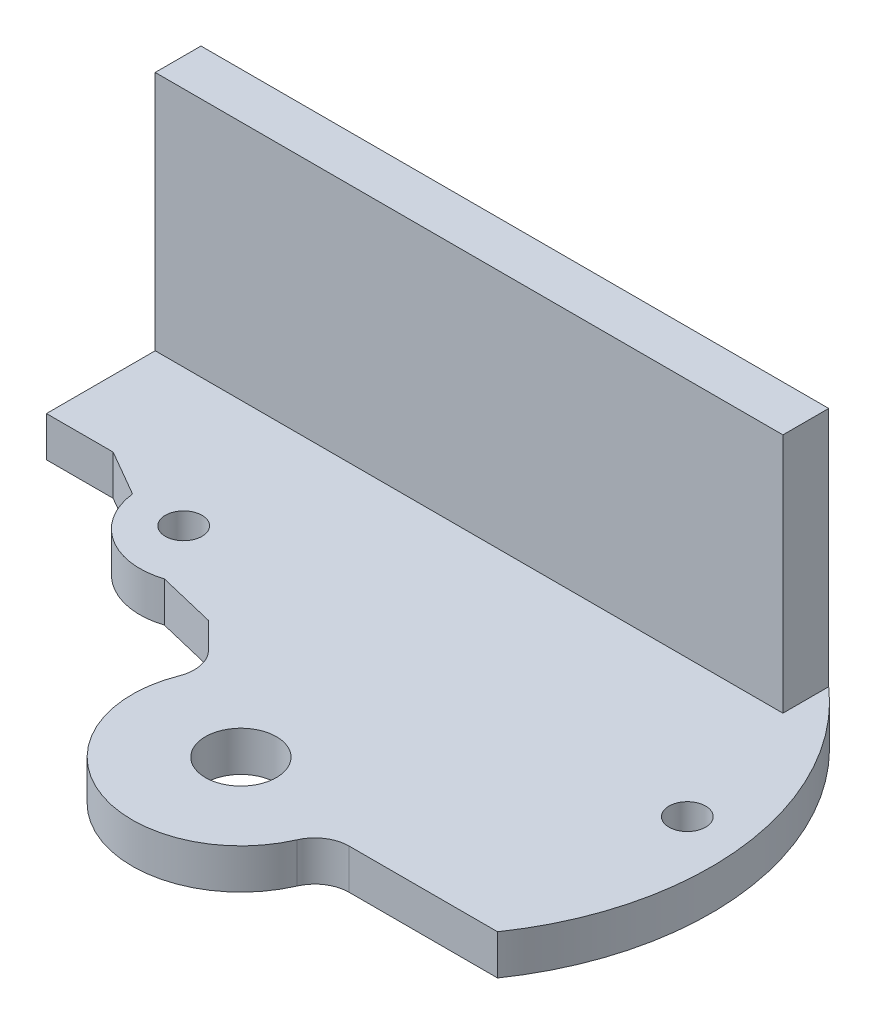
ISO-10303-21;
HEADER;
FILE_DESCRIPTION(('STEP AP214'),'2;1');
FILE_NAME('part.step','',(''),(''),'','','');
FILE_SCHEMA(('AUTOMOTIVE_DESIGN { 1 0 10303 214 1 1 1 1 }'));
ENDSEC;
DATA;
#1=APPLICATION_CONTEXT('core data for automotive mechanical design processes');
#2=APPLICATION_PROTOCOL_DEFINITION('international standard','automotive_design',2000,#1);
#3=PRODUCT_CONTEXT('',#1,'mechanical');
#4=PRODUCT('Part','Part','',(#3));
#5=PRODUCT_RELATED_PRODUCT_CATEGORY('part','',(#4));
#6=PRODUCT_DEFINITION_FORMATION('','',#4);
#7=PRODUCT_DEFINITION_CONTEXT('part definition',#1,'design');
#8=PRODUCT_DEFINITION('design','',#6,#7);
#9=PRODUCT_DEFINITION_SHAPE('','',#8);
#10=(LENGTH_UNIT() NAMED_UNIT(*) SI_UNIT(.MILLI.,.METRE.));
#11=(NAMED_UNIT(*) PLANE_ANGLE_UNIT() SI_UNIT($,.RADIAN.));
#12=(NAMED_UNIT(*) SI_UNIT($,.STERADIAN.) SOLID_ANGLE_UNIT());
#13=UNCERTAINTY_MEASURE_WITH_UNIT(LENGTH_MEASURE(1.E-05),#10,'distance_accuracy_value','');
#14=(GEOMETRIC_REPRESENTATION_CONTEXT(3) GLOBAL_UNCERTAINTY_ASSIGNED_CONTEXT((#13)) GLOBAL_UNIT_ASSIGNED_CONTEXT((#10,
#11,#12)) REPRESENTATION_CONTEXT('',''));
#15=CARTESIAN_POINT('',(0.,0.,0.));
#16=DIRECTION('',(0.,0.,1.));
#17=DIRECTION('',(1.,0.,0.));
#18=AXIS2_PLACEMENT_3D('',#15,#16,#17);
#19=CARTESIAN_POINT('',(20.3496,17.,-13.5));
#20=DIRECTION('',(0.,0.,1.));
#21=DIRECTION('',(1.,0.,0.));
#22=AXIS2_PLACEMENT_3D('',#19,#20,#21);
#23=PLANE('',#22);
#24=DIRECTION('',(-1.,0.,0.));
#25=VECTOR('',#24,1.);
#26=CARTESIAN_POINT('',(20.3496,13.5,-13.5));
#27=LINE('',#26,#25);
#28=CARTESIAN_POINT('',(20.3496,13.5,-13.5));
#29=VERTEX_POINT('',#28);
#30=CARTESIAN_POINT('',(-34.4868,13.5,-13.5));
#31=VERTEX_POINT('',#30);
#32=EDGE_CURVE('E170',#29,#31,#27,.T.);
#33=ORIENTED_EDGE('',*,*,#32,.T.);
#34=DIRECTION('',(0.,-1.,0.));
#35=VECTOR('',#34,1.);
#36=CARTESIAN_POINT('',(-34.4868,17.,-13.5));
#37=LINE('',#36,#35);
#38=CARTESIAN_POINT('',(-34.4868,38.0559630595284,-13.5));
#39=VERTEX_POINT('',#38);
#40=EDGE_CURVE('E12',#39,#31,#37,.T.);
#41=ORIENTED_EDGE('',*,*,#40,.F.);
#42=DIRECTION('',(1.,0.,0.));
#43=VECTOR('',#42,1.);
#44=CARTESIAN_POINT('',(-34.4868,38.0559630595284,-13.5));
#45=LINE('',#44,#43);
#46=CARTESIAN_POINT('',(20.3496,38.0559630595284,-13.5));
#47=VERTEX_POINT('',#46);
#48=EDGE_CURVE('E299',#39,#47,#45,.T.);
#49=ORIENTED_EDGE('',*,*,#48,.T.);
#50=DIRECTION('',(0.,-1.,0.));
#51=VECTOR('',#50,1.);
#52=CARTESIAN_POINT('',(20.3496,38.0559630595284,-13.5));
#53=LINE('',#52,#51);
#54=CARTESIAN_POINT('',(20.3496,17.,-13.5));
#55=VERTEX_POINT('',#54);
#56=EDGE_CURVE('E288',#47,#55,#53,.T.);
#57=ORIENTED_EDGE('',*,*,#56,.T.);
#58=DIRECTION('',(0.,-1.,0.));
#59=VECTOR('',#58,1.);
#60=CARTESIAN_POINT('',(20.3496,17.,-13.5));
#61=LINE('',#60,#59);
#62=EDGE_CURVE('E169',#55,#29,#61,.T.);
#63=ORIENTED_EDGE('',*,*,#62,.T.);
#64=EDGE_LOOP('',(#33,#41,#49,#57,#63));
#65=FACE_BOUND('',#64,.T.);
#66=ADVANCED_FACE('F36',(#65),#23,.F.);
#67=CARTESIAN_POINT('',(-34.4868,17.,-13.5));
#68=DIRECTION('',(1.,0.,0.));
#69=DIRECTION('',(0.,0.,-1.));
#70=AXIS2_PLACEMENT_3D('',#67,#68,#69);
#71=PLANE('',#70);
#72=DIRECTION('',(0.,0.,1.));
#73=VECTOR('',#72,1.);
#74=CARTESIAN_POINT('',(-34.4868,13.5,-13.5));
#75=LINE('',#74,#73);
#76=CARTESIAN_POINT('',(-34.4868,13.5,0.));
#77=VERTEX_POINT('',#76);
#78=EDGE_CURVE('E173',#31,#77,#75,.T.);
#79=ORIENTED_EDGE('',*,*,#78,.T.);
#80=DIRECTION('',(0.,-1.,0.));
#81=VECTOR('',#80,1.);
#82=CARTESIAN_POINT('',(-34.4868,17.,0.));
#83=LINE('',#82,#81);
#84=CARTESIAN_POINT('',(-34.4868,17.,0.));
#85=VERTEX_POINT('',#84);
#86=EDGE_CURVE('E44',#85,#77,#83,.T.);
#87=ORIENTED_EDGE('',*,*,#86,.F.);
#88=DIRECTION('',(0.,0.,1.));
#89=VECTOR('',#88,1.);
#90=CARTESIAN_POINT('',(-34.4868,17.,-13.5));
#91=LINE('',#90,#89);
#92=CARTESIAN_POINT('',(-34.4868,17.,-9.49999999999999));
#93=VERTEX_POINT('',#92);
#94=EDGE_CURVE('E114',#93,#85,#91,.T.);
#95=ORIENTED_EDGE('',*,*,#94,.F.);
#96=DIRECTION('',(0.,1.,0.));
#97=VECTOR('',#96,1.);
#98=CARTESIAN_POINT('',(-34.4868,17.,-9.49999999999999));
#99=LINE('',#98,#97);
#100=CARTESIAN_POINT('',(-34.4868,38.0559630595284,-9.49999999999999));
#101=VERTEX_POINT('',#100);
#102=EDGE_CURVE('E52',#93,#101,#99,.T.);
#103=ORIENTED_EDGE('',*,*,#102,.T.);
#104=DIRECTION('',(0.,0.,-1.));
#105=VECTOR('',#104,1.);
#106=CARTESIAN_POINT('',(-34.4868,38.0559630595284,-9.49999999999999));
#107=LINE('',#106,#105);
#108=EDGE_CURVE('E289',#101,#39,#107,.T.);
#109=ORIENTED_EDGE('',*,*,#108,.T.);
#110=ORIENTED_EDGE('',*,*,#40,.T.);
#111=EDGE_LOOP('',(#79,#87,#95,#103,#109,#110));
#112=FACE_BOUND('',#111,.T.);
#113=ADVANCED_FACE('F330',(#112),#71,.F.);
#114=CARTESIAN_POINT('',(-34.4868,17.,0.));
#115=DIRECTION('',(0.,0.,-1.));
#116=DIRECTION('',(-1.,0.,0.));
#117=AXIS2_PLACEMENT_3D('',#114,#115,#116);
#118=PLANE('',#117);
#119=DIRECTION('',(1.,0.,0.));
#120=VECTOR('',#119,1.);
#121=CARTESIAN_POINT('',(-34.4868,13.5,0.));
#122=LINE('',#121,#120);
#123=CARTESIAN_POINT('',(-28.6613749786786,13.5,0.));
#124=VERTEX_POINT('',#123);
#125=EDGE_CURVE('E176',#77,#124,#122,.T.);
#126=ORIENTED_EDGE('',*,*,#125,.T.);
#127=DIRECTION('',(0.,-1.,0.));
#128=VECTOR('',#127,1.);
#129=CARTESIAN_POINT('',(-28.6613749786786,17.,0.));
#130=LINE('',#129,#128);
#131=CARTESIAN_POINT('',(-28.6613749786786,17.,0.));
#132=VERTEX_POINT('',#131);
#133=EDGE_CURVE('E211',#132,#124,#130,.T.);
#134=ORIENTED_EDGE('',*,*,#133,.F.);
#135=DIRECTION('',(1.,0.,0.));
#136=VECTOR('',#135,1.);
#137=CARTESIAN_POINT('',(-34.4868,17.,0.));
#138=LINE('',#137,#136);
#139=EDGE_CURVE('E229',#85,#132,#138,.T.);
#140=ORIENTED_EDGE('',*,*,#139,.F.);
#141=ORIENTED_EDGE('',*,*,#86,.T.);
#142=EDGE_LOOP('',(#126,#134,#140,#141));
#143=FACE_BOUND('',#142,.T.);
#144=ADVANCED_FACE('F335',(#143),#118,.F.);
#145=CARTESIAN_POINT('',(-28.6613749786786,17.,0.));
#146=DIRECTION('',(0.500442701800588,0.,-0.865769658866911));
#147=DIRECTION('',(-0.865769658866911,0.,-0.500442701800588));
#148=AXIS2_PLACEMENT_3D('',#145,#146,#147);
#149=PLANE('',#148);
#150=DIRECTION('',(0.865769658866911,0.,0.500442701800588));
#151=VECTOR('',#150,1.);
#152=CARTESIAN_POINT('',(-28.6613749786786,13.5,0.));
#153=LINE('',#152,#151);
#154=CARTESIAN_POINT('',(-24.6424002082218,13.5,2.32309664816397));
#155=VERTEX_POINT('',#154);
#156=EDGE_CURVE('E178',#124,#155,#153,.T.);
#157=ORIENTED_EDGE('',*,*,#156,.T.);
#158=DIRECTION('',(0.,-1.,0.));
#159=VECTOR('',#158,1.);
#160=CARTESIAN_POINT('',(-24.6424002082218,17.,2.32309664816397));
#161=LINE('',#160,#159);
#162=CARTESIAN_POINT('',(-24.6424002082218,17.,2.32309664816397));
#163=VERTEX_POINT('',#162);
#164=EDGE_CURVE('E208',#163,#155,#161,.T.);
#165=ORIENTED_EDGE('',*,*,#164,.F.);
#166=DIRECTION('',(0.865769658866911,0.,0.500442701800588));
#167=VECTOR('',#166,1.);
#168=CARTESIAN_POINT('',(-28.6613749786786,17.,0.));
#169=LINE('',#168,#167);
#170=EDGE_CURVE('E237',#132,#163,#169,.T.);
#171=ORIENTED_EDGE('',*,*,#170,.F.);
#172=ORIENTED_EDGE('',*,*,#133,.T.);
#173=EDGE_LOOP('',(#157,#165,#171,#172));
#174=FACE_BOUND('',#173,.T.);
#175=ADVANCED_FACE('F347',(#174),#149,.F.);
#176=CARTESIAN_POINT('',(-18.6805102122051,17.,1.64791691254111));
#177=DIRECTION('',(0.,-1.,0.));
#178=DIRECTION('',(0.,0.,-1.));
#179=AXIS2_PLACEMENT_3D('',#176,#177,#178);
#180=CYLINDRICAL_SURFACE('',#179,6.);
#181=CARTESIAN_POINT('',(-18.6805102122051,13.5,1.64791691254111));
#182=DIRECTION('',(0.,1.,0.));
#183=DIRECTION('',(0.,0.,1.));
#184=AXIS2_PLACEMENT_3D('',#181,#182,#183);
#185=CIRCLE('',#184,6.);
#186=CARTESIAN_POINT('',(-16.8299633080181,13.5,7.35540989592743));
#187=VERTEX_POINT('',#186);
#188=EDGE_CURVE('E180',#155,#187,#185,.T.);
#189=ORIENTED_EDGE('',*,*,#188,.T.);
#190=DIRECTION('',(0.,-1.,0.));
#191=VECTOR('',#190,1.);
#192=CARTESIAN_POINT('',(-16.8299633080181,17.,7.35540989592743));
#193=LINE('',#192,#191);
#194=CARTESIAN_POINT('',(-16.8299633080181,17.,7.35540989592743));
#195=VERTEX_POINT('',#194);
#196=EDGE_CURVE('E205',#195,#187,#193,.T.);
#197=ORIENTED_EDGE('',*,*,#196,.F.);
#198=CARTESIAN_POINT('',(-18.6805102122051,17.,1.64791691254111));
#199=DIRECTION('',(0.,1.,0.));
#200=DIRECTION('',(0.,0.,1.));
#201=AXIS2_PLACEMENT_3D('',#198,#199,#200);
#202=CIRCLE('',#201,6.);
#203=EDGE_CURVE('E239',#163,#195,#202,.T.);
#204=ORIENTED_EDGE('',*,*,#203,.F.);
#205=ORIENTED_EDGE('',*,*,#164,.T.);
#206=EDGE_LOOP('',(#189,#197,#204,#205));
#207=FACE_BOUND('',#206,.T.);
#208=ADVANCED_FACE('F350',(#207),#180,.T.);
#209=CARTESIAN_POINT('',(-16.8299633080181,17.,7.35540989592743));
#210=DIRECTION('',(0.233748216217537,0.,-0.972297162093524));
#211=DIRECTION('',(-0.972297162093524,0.,-0.233748216217537));
#212=AXIS2_PLACEMENT_3D('',#209,#210,#211);
#213=PLANE('',#212);
#214=DIRECTION('',(0.972297162093524,0.,0.233748216217537));
#215=VECTOR('',#214,1.);
#216=CARTESIAN_POINT('',(-16.8299633080181,13.5,7.35540989592743));
#217=LINE('',#216,#215);
#218=CARTESIAN_POINT('',(-11.7523069819295,13.5,8.57612014281668));
#219=VERTEX_POINT('',#218);
#220=EDGE_CURVE('E182',#187,#219,#217,.T.);
#221=ORIENTED_EDGE('',*,*,#220,.T.);
#222=DIRECTION('',(0.,-1.,0.));
#223=VECTOR('',#222,1.);
#224=CARTESIAN_POINT('',(-11.7523069819295,17.,8.57612014281668));
#225=LINE('',#224,#223);
#226=CARTESIAN_POINT('',(-11.7523069819295,17.,8.57612014281668));
#227=VERTEX_POINT('',#226);
#228=EDGE_CURVE('E202',#227,#219,#225,.T.);
#229=ORIENTED_EDGE('',*,*,#228,.F.);
#230=DIRECTION('',(0.972297162093524,0.,0.233748216217537));
#231=VECTOR('',#230,1.);
#232=CARTESIAN_POINT('',(-16.8299633080181,17.,7.35540989592743));
#233=LINE('',#232,#231);
#234=EDGE_CURVE('E241',#195,#227,#233,.T.);
#235=ORIENTED_EDGE('',*,*,#234,.F.);
#236=ORIENTED_EDGE('',*,*,#196,.T.);
#237=EDGE_LOOP('',(#221,#229,#235,#236));
#238=FACE_BOUND('',#237,.T.);
#239=ADVANCED_FACE('F353',(#238),#213,.F.);
#240=CARTESIAN_POINT('',(-11.7523069819295,17.,8.57612014281668));
#241=DIRECTION('',(0.707106781186547,0.,-0.707106781186548));
#242=DIRECTION('',(-0.707106781186548,0.,-0.707106781186547));
#243=AXIS2_PLACEMENT_3D('',#240,#241,#242);
#244=PLANE('',#243);
#245=DIRECTION('',(0.707106781186548,0.,0.707106781186547));
#246=VECTOR('',#245,1.);
#247=CARTESIAN_POINT('',(-11.7523069819295,13.5,8.57612014281668));
#248=LINE('',#247,#246);
#249=CARTESIAN_POINT('',(-9.51513943538292,13.5,10.8132876893633));
#250=VERTEX_POINT('',#249);
#251=EDGE_CURVE('E184',#219,#250,#248,.T.);
#252=ORIENTED_EDGE('',*,*,#251,.T.);
#253=DIRECTION('',(0.,-1.,0.));
#254=VECTOR('',#253,1.);
#255=CARTESIAN_POINT('',(-9.51513943538292,17.,10.8132876893633));
#256=LINE('',#255,#254);
#257=CARTESIAN_POINT('',(-9.51513943538292,17.,10.8132876893633));
#258=VERTEX_POINT('',#257);
#259=EDGE_CURVE('E199',#258,#250,#256,.T.);
#260=ORIENTED_EDGE('',*,*,#259,.F.);
#261=DIRECTION('',(0.707106781186548,0.,0.707106781186547));
#262=VECTOR('',#261,1.);
#263=CARTESIAN_POINT('',(-11.7523069819295,17.,8.57612014281668));
#264=LINE('',#263,#262);
#265=EDGE_CURVE('E243',#227,#258,#264,.T.);
#266=ORIENTED_EDGE('',*,*,#265,.F.);
#267=ORIENTED_EDGE('',*,*,#228,.T.);
#268=EDGE_LOOP('',(#252,#260,#266,#267));
#269=FACE_BOUND('',#268,.T.);
#270=ADVANCED_FACE('F249',(#269),#244,.F.);
#271=CARTESIAN_POINT('',(-11.6364597789426,17.,12.9346080329229));
#272=DIRECTION('',(0.,-1.,0.));
#273=DIRECTION('',(0.,0.,-1.));
#274=AXIS2_PLACEMENT_3D('',#271,#272,#273);
#275=CYLINDRICAL_SURFACE('',#274,3.);
#276=CARTESIAN_POINT('',(-11.6364597789426,13.5,12.9346080329229));
#277=DIRECTION('',(0.,-1.,0.));
#278=DIRECTION('',(0.,0.,1.));
#279=AXIS2_PLACEMENT_3D('',#276,#277,#278);
#280=CIRCLE('',#279,3.);
#281=CARTESIAN_POINT('',(-8.84370943199635,13.5,14.0303021050214));
#282=VERTEX_POINT('',#281);
#283=EDGE_CURVE('E186',#250,#282,#280,.T.);
#284=ORIENTED_EDGE('',*,*,#283,.T.);
#285=DIRECTION('',(0.,-1.,0.));
#286=VECTOR('',#285,1.);
#287=CARTESIAN_POINT('',(-8.84370943199635,17.,14.0303021050214));
#288=LINE('',#287,#286);
#289=CARTESIAN_POINT('',(-8.84370943199635,17.,14.0303021050214));
#290=VERTEX_POINT('',#289);
#291=EDGE_CURVE('E158',#290,#282,#288,.T.);
#292=ORIENTED_EDGE('',*,*,#291,.F.);
#293=CARTESIAN_POINT('',(-11.6364597789426,17.,12.9346080329229));
#294=DIRECTION('',(0.,-1.,0.));
#295=DIRECTION('',(0.,0.,1.));
#296=AXIS2_PLACEMENT_3D('',#293,#294,#295);
#297=CIRCLE('',#296,3.);
#298=EDGE_CURVE('E146',#258,#290,#297,.T.);
#299=ORIENTED_EDGE('',*,*,#298,.F.);
#300=ORIENTED_EDGE('',*,*,#259,.T.);
#301=EDGE_LOOP('',(#284,#292,#299,#300));
#302=FACE_BOUND('',#301,.T.);
#303=ADVANCED_FACE('F253',(#302),#275,.F.);
#304=CARTESIAN_POINT('',(0.,17.,17.5));
#305=DIRECTION('',(0.,-1.,0.));
#306=DIRECTION('',(0.,0.,-1.));
#307=AXIS2_PLACEMENT_3D('',#304,#305,#306);
#308=CYLINDRICAL_SURFACE('',#307,9.5);
#309=CARTESIAN_POINT('',(0.,13.5,17.5));
#310=DIRECTION('',(0.,1.,0.));
#311=DIRECTION('',(0.,0.,1.));
#312=AXIS2_PLACEMENT_3D('',#309,#310,#311);
#313=CIRCLE('',#312,9.5);
#314=CARTESIAN_POINT('',(8.7068938204161,13.5,21.3));
#315=VERTEX_POINT('',#314);
#316=EDGE_CURVE('E155',#282,#315,#313,.T.);
#317=ORIENTED_EDGE('',*,*,#316,.T.);
#318=DIRECTION('',(0.,-1.,0.));
#319=VECTOR('',#318,1.);
#320=CARTESIAN_POINT('',(8.7068938204161,17.,21.3));
#321=LINE('',#320,#319);
#322=CARTESIAN_POINT('',(8.7068938204161,17.,21.3));
#323=VERTEX_POINT('',#322);
#324=EDGE_CURVE('E152',#323,#315,#321,.T.);
#325=ORIENTED_EDGE('',*,*,#324,.F.);
#326=CARTESIAN_POINT('',(0.,17.,17.5));
#327=DIRECTION('',(0.,1.,0.));
#328=DIRECTION('',(0.,0.,1.));
#329=AXIS2_PLACEMENT_3D('',#326,#327,#328);
#330=CIRCLE('',#329,9.5);
#331=EDGE_CURVE('E137',#290,#323,#330,.T.);
#332=ORIENTED_EDGE('',*,*,#331,.F.);
#333=ORIENTED_EDGE('',*,*,#291,.T.);
#334=EDGE_LOOP('',(#317,#325,#332,#333));
#335=FACE_BOUND('',#334,.T.);
#336=ADVANCED_FACE('F153',(#335),#308,.T.);
#337=CARTESIAN_POINT('',(11.4564392373896,17.,22.5));
#338=DIRECTION('',(0.,-1.,0.));
#339=DIRECTION('',(0.,0.,-1.));
#340=AXIS2_PLACEMENT_3D('',#337,#338,#339);
#341=CYLINDRICAL_SURFACE('',#340,3.);
#342=CARTESIAN_POINT('',(11.4564392373896,13.5,22.5));
#343=DIRECTION('',(0.,-1.,0.));
#344=DIRECTION('',(0.,0.,1.));
#345=AXIS2_PLACEMENT_3D('',#342,#343,#344);
#346=CIRCLE('',#345,3.);
#347=CARTESIAN_POINT('',(11.4564392373896,13.5,19.5));
#348=VERTEX_POINT('',#347);
#349=EDGE_CURVE('E189',#315,#348,#346,.T.);
#350=ORIENTED_EDGE('',*,*,#349,.T.);
#351=DIRECTION('',(0.,-1.,0.));
#352=VECTOR('',#351,1.);
#353=CARTESIAN_POINT('',(11.4564392373896,17.,19.5));
#354=LINE('',#353,#352);
#355=CARTESIAN_POINT('',(11.4564392373896,17.,19.5));
#356=VERTEX_POINT('',#355);
#357=EDGE_CURVE('E159',#356,#348,#354,.T.);
#358=ORIENTED_EDGE('',*,*,#357,.F.);
#359=CARTESIAN_POINT('',(11.4564392373896,17.,22.5));
#360=DIRECTION('',(0.,-1.,0.));
#361=DIRECTION('',(0.,0.,1.));
#362=AXIS2_PLACEMENT_3D('',#359,#360,#361);
#363=CIRCLE('',#362,3.);
#364=EDGE_CURVE('E143',#323,#356,#363,.T.);
#365=ORIENTED_EDGE('',*,*,#364,.F.);
#366=ORIENTED_EDGE('',*,*,#324,.T.);
#367=EDGE_LOOP('',(#350,#358,#365,#366));
#368=FACE_BOUND('',#367,.T.);
#369=ADVANCED_FACE('F161',(#368),#341,.F.);
#370=CARTESIAN_POINT('',(11.4564392373896,17.,19.5));
#371=DIRECTION('',(0.,0.,-1.));
#372=DIRECTION('',(-1.,0.,0.));
#373=AXIS2_PLACEMENT_3D('',#370,#371,#372);
#374=PLANE('',#373);
#375=DIRECTION('',(1.,0.,0.));
#376=VECTOR('',#375,1.);
#377=CARTESIAN_POINT('',(11.4564392373896,13.5,19.5));
#378=LINE('',#377,#376);
#379=CARTESIAN_POINT('',(24.4182308941496,13.5,19.5));
#380=VERTEX_POINT('',#379);
#381=EDGE_CURVE('E191',#348,#380,#378,.T.);
#382=ORIENTED_EDGE('',*,*,#381,.T.);
#383=DIRECTION('',(0.,-1.,0.));
#384=VECTOR('',#383,1.);
#385=CARTESIAN_POINT('',(24.4182308941496,17.,19.5));
#386=LINE('',#385,#384);
#387=CARTESIAN_POINT('',(24.4182308941496,17.,19.5));
#388=VERTEX_POINT('',#387);
#389=EDGE_CURVE('E195',#388,#380,#386,.T.);
#390=ORIENTED_EDGE('',*,*,#389,.F.);
#391=DIRECTION('',(1.,0.,0.));
#392=VECTOR('',#391,1.);
#393=CARTESIAN_POINT('',(11.4564392373896,17.,19.5));
#394=LINE('',#393,#392);
#395=EDGE_CURVE('E61',#356,#388,#394,.T.);
#396=ORIENTED_EDGE('',*,*,#395,.F.);
#397=ORIENTED_EDGE('',*,*,#357,.T.);
#398=EDGE_LOOP('',(#382,#390,#396,#397));
#399=FACE_BOUND('',#398,.T.);
#400=ADVANCED_FACE('F259',(#399),#374,.F.);
#401=CARTESIAN_POINT('',(3.8530842496332,17.,5.28470037285398));
#402=DIRECTION('',(0.,-1.,0.));
#403=DIRECTION('',(0.,0.,-1.));
#404=AXIS2_PLACEMENT_3D('',#401,#402,#403);
#405=CYLINDRICAL_SURFACE('',#404,25.);
#406=CARTESIAN_POINT('',(3.8530842496332,13.5,5.28470037285398));
#407=DIRECTION('',(0.,1.,0.));
#408=DIRECTION('',(0.,0.,1.));
#409=AXIS2_PLACEMENT_3D('',#406,#407,#408);
#410=CIRCLE('',#409,25.);
#411=EDGE_CURVE('E107',#380,#29,#410,.T.);
#412=ORIENTED_EDGE('',*,*,#411,.T.);
#413=ORIENTED_EDGE('',*,*,#62,.F.);
#414=CARTESIAN_POINT('',(3.8530842496332,17.,5.28470037285398));
#415=DIRECTION('',(0.,1.,0.));
#416=DIRECTION('',(0.,0.,1.));
#417=AXIS2_PLACEMENT_3D('',#414,#415,#416);
#418=CIRCLE('',#417,25.);
#419=EDGE_CURVE('E164',#388,#55,#418,.T.);
#420=ORIENTED_EDGE('',*,*,#419,.F.);
#421=ORIENTED_EDGE('',*,*,#389,.T.);
#422=EDGE_LOOP('',(#412,#413,#420,#421));
#423=FACE_BOUND('',#422,.T.);
#424=ADVANCED_FACE('F261',(#423),#405,.T.);
#425=CARTESIAN_POINT('',(-18.6805102122051,17.,1.64791691254111));
#426=DIRECTION('',(0.,1.,0.));
#427=DIRECTION('',(0.,0.,1.));
#428=AXIS2_PLACEMENT_3D('',#425,#426,#427);
#429=PLANE('',#428);
#430=DIRECTION('',(0.,0.,-1.));
#431=VECTOR('',#430,1.);
#432=CARTESIAN_POINT('',(20.3496,17.,-9.49999999999999));
#433=LINE('',#432,#431);
#434=CARTESIAN_POINT('',(20.3496,17.,-9.49999999999999));
#435=VERTEX_POINT('',#434);
#436=EDGE_CURVE('E263',#435,#55,#433,.T.);
#437=ORIENTED_EDGE('',*,*,#436,.F.);
#438=DIRECTION('',(-1.,0.,0.));
#439=VECTOR('',#438,1.);
#440=CARTESIAN_POINT('',(20.3496,17.,-9.49999999999999));
#441=LINE('',#440,#439);
#442=EDGE_CURVE('E230',#435,#93,#441,.T.);
#443=ORIENTED_EDGE('',*,*,#442,.T.);
#444=ORIENTED_EDGE('',*,*,#94,.T.);
#445=ORIENTED_EDGE('',*,*,#139,.T.);
#446=ORIENTED_EDGE('',*,*,#170,.T.);
#447=ORIENTED_EDGE('',*,*,#203,.T.);
#448=ORIENTED_EDGE('',*,*,#234,.T.);
#449=ORIENTED_EDGE('',*,*,#265,.T.);
#450=ORIENTED_EDGE('',*,*,#298,.T.);
#451=ORIENTED_EDGE('',*,*,#331,.T.);
#452=ORIENTED_EDGE('',*,*,#364,.T.);
#453=ORIENTED_EDGE('',*,*,#395,.T.);
#454=ORIENTED_EDGE('',*,*,#419,.T.);
#455=EDGE_LOOP('',(#437,#443,#444,#445,#446,#447,#448,#449,#450,#451,#452,#453,#454));
#456=FACE_BOUND('',#455,.T.);
#457=CARTESIAN_POINT('',(0.,17.,17.5));
#458=DIRECTION('',(0.,1.,0.));
#459=DIRECTION('',(0.,0.,1.));
#460=AXIS2_PLACEMENT_3D('',#457,#458,#459);
#461=CIRCLE('',#460,3.1);
#462=CARTESIAN_POINT('',(0.,17.,20.6));
#463=VERTEX_POINT('',#462);
#464=EDGE_CURVE('E226',#463,#463,#461,.T.);
#465=ORIENTED_EDGE('',*,*,#464,.F.);
#466=EDGE_LOOP('',(#465));
#467=FACE_BOUND('',#466,.T.);
#468=CARTESIAN_POINT('',(24.,17.,2.50000000000001));
#469=DIRECTION('',(0.,1.,0.));
#470=DIRECTION('',(0.,0.,1.));
#471=AXIS2_PLACEMENT_3D('',#468,#469,#470);
#472=CIRCLE('',#471,1.6);
#473=CARTESIAN_POINT('',(24.,17.,4.10000000000001));
#474=VERTEX_POINT('',#473);
#475=EDGE_CURVE('E222',#474,#474,#472,.T.);
#476=ORIENTED_EDGE('',*,*,#475,.F.);
#477=EDGE_LOOP('',(#476));
#478=FACE_BOUND('',#477,.T.);
#479=CARTESIAN_POINT('',(-20.,17.,2.50000000000001));
#480=DIRECTION('',(0.,1.,0.));
#481=DIRECTION('',(0.,0.,1.));
#482=AXIS2_PLACEMENT_3D('',#479,#480,#481);
#483=CIRCLE('',#482,1.6);
#484=CARTESIAN_POINT('',(-20.,17.,4.10000000000001));
#485=VERTEX_POINT('',#484);
#486=EDGE_CURVE('E218',#485,#485,#483,.T.);
#487=ORIENTED_EDGE('',*,*,#486,.F.);
#488=EDGE_LOOP('',(#487));
#489=FACE_BOUND('',#488,.T.);
#490=ADVANCED_FACE('F140',(#456,#467,#478,#489),#429,.T.);
#491=CARTESIAN_POINT('',(-18.6805102122051,13.5,1.64791691254111));
#492=DIRECTION('',(0.,1.,0.));
#493=DIRECTION('',(0.,0.,1.));
#494=AXIS2_PLACEMENT_3D('',#491,#492,#493);
#495=PLANE('',#494);
#496=CARTESIAN_POINT('',(0.,13.5,17.5));
#497=DIRECTION('',(0.,1.,0.));
#498=DIRECTION('',(0.,0.,1.));
#499=AXIS2_PLACEMENT_3D('',#496,#497,#498);
#500=CIRCLE('',#499,3.1);
#501=CARTESIAN_POINT('',(0.,13.5,20.6));
#502=VERTEX_POINT('',#501);
#503=EDGE_CURVE('E223',#502,#502,#500,.T.);
#504=ORIENTED_EDGE('',*,*,#503,.T.);
#505=EDGE_LOOP('',(#504));
#506=FACE_BOUND('',#505,.T.);
#507=CARTESIAN_POINT('',(24.,13.5,2.50000000000001));
#508=DIRECTION('',(0.,1.,0.));
#509=DIRECTION('',(0.,0.,1.));
#510=AXIS2_PLACEMENT_3D('',#507,#508,#509);
#511=CIRCLE('',#510,1.6);
#512=CARTESIAN_POINT('',(24.,13.5,4.10000000000001));
#513=VERTEX_POINT('',#512);
#514=EDGE_CURVE('E219',#513,#513,#511,.T.);
#515=ORIENTED_EDGE('',*,*,#514,.T.);
#516=EDGE_LOOP('',(#515));
#517=FACE_BOUND('',#516,.T.);
#518=CARTESIAN_POINT('',(-20.,13.5,2.50000000000001));
#519=DIRECTION('',(0.,1.,0.));
#520=DIRECTION('',(0.,0.,1.));
#521=AXIS2_PLACEMENT_3D('',#518,#519,#520);
#522=CIRCLE('',#521,1.6);
#523=CARTESIAN_POINT('',(-20.,13.5,4.10000000000001));
#524=VERTEX_POINT('',#523);
#525=EDGE_CURVE('E174',#524,#524,#522,.T.);
#526=ORIENTED_EDGE('',*,*,#525,.T.);
#527=EDGE_LOOP('',(#526));
#528=FACE_BOUND('',#527,.T.);
#529=ORIENTED_EDGE('',*,*,#32,.F.);
#530=ORIENTED_EDGE('',*,*,#411,.F.);
#531=ORIENTED_EDGE('',*,*,#381,.F.);
#532=ORIENTED_EDGE('',*,*,#349,.F.);
#533=ORIENTED_EDGE('',*,*,#316,.F.);
#534=ORIENTED_EDGE('',*,*,#283,.F.);
#535=ORIENTED_EDGE('',*,*,#251,.F.);
#536=ORIENTED_EDGE('',*,*,#220,.F.);
#537=ORIENTED_EDGE('',*,*,#188,.F.);
#538=ORIENTED_EDGE('',*,*,#156,.F.);
#539=ORIENTED_EDGE('',*,*,#125,.F.);
#540=ORIENTED_EDGE('',*,*,#78,.F.);
#541=EDGE_LOOP('',(#529,#530,#531,#532,#533,#534,#535,#536,#537,#538,#539,#540));
#542=FACE_BOUND('',#541,.T.);
#543=ADVANCED_FACE('F256',(#506,#517,#528,#542),#495,.F.);
#544=CARTESIAN_POINT('',(-20.,0.,2.50000000000001));
#545=DIRECTION('',(0.,1.,0.));
#546=DIRECTION('',(0.,0.,1.));
#547=AXIS2_PLACEMENT_3D('',#544,#545,#546);
#548=CYLINDRICAL_SURFACE('',#547,1.6);
#549=ORIENTED_EDGE('',*,*,#486,.T.);
#550=EDGE_LOOP('',(#549));
#551=FACE_BOUND('',#550,.T.);
#552=ORIENTED_EDGE('',*,*,#525,.F.);
#553=EDGE_LOOP('',(#552));
#554=FACE_BOUND('',#553,.T.);
#555=ADVANCED_FACE('F316',(#551,#554),#548,.F.);
#556=CARTESIAN_POINT('',(24.,0.,2.50000000000001));
#557=DIRECTION('',(0.,1.,0.));
#558=DIRECTION('',(0.,0.,1.));
#559=AXIS2_PLACEMENT_3D('',#556,#557,#558);
#560=CYLINDRICAL_SURFACE('',#559,1.6);
#561=ORIENTED_EDGE('',*,*,#475,.T.);
#562=EDGE_LOOP('',(#561));
#563=FACE_BOUND('',#562,.T.);
#564=ORIENTED_EDGE('',*,*,#514,.F.);
#565=EDGE_LOOP('',(#564));
#566=FACE_BOUND('',#565,.T.);
#567=ADVANCED_FACE('F307',(#563,#566),#560,.F.);
#568=CARTESIAN_POINT('',(0.,12.,17.5));
#569=DIRECTION('',(0.,1.,0.));
#570=DIRECTION('',(0.,0.,1.));
#571=AXIS2_PLACEMENT_3D('',#568,#569,#570);
#572=CYLINDRICAL_SURFACE('',#571,3.1);
#573=ORIENTED_EDGE('',*,*,#464,.T.);
#574=EDGE_LOOP('',(#573));
#575=FACE_BOUND('',#574,.T.);
#576=ORIENTED_EDGE('',*,*,#503,.F.);
#577=EDGE_LOOP('',(#576));
#578=FACE_BOUND('',#577,.T.);
#579=ADVANCED_FACE('F437',(#575,#578),#572,.F.);
#580=CARTESIAN_POINT('',(20.3496,38.0559630595284,-9.49999999999999));
#581=DIRECTION('',(1.,0.,0.));
#582=DIRECTION('',(0.,1.,0.));
#583=AXIS2_PLACEMENT_3D('',#580,#581,#582);
#584=PLANE('',#583);
#585=ORIENTED_EDGE('',*,*,#56,.F.);
#586=DIRECTION('',(0.,0.,-1.));
#587=VECTOR('',#586,1.);
#588=CARTESIAN_POINT('',(20.3496,38.0559630595284,-9.49999999999999));
#589=LINE('',#588,#587);
#590=CARTESIAN_POINT('',(20.3496,38.0559630595284,-9.49999999999999));
#591=VERTEX_POINT('',#590);
#592=EDGE_CURVE('E279',#591,#47,#589,.T.);
#593=ORIENTED_EDGE('',*,*,#592,.F.);
#594=DIRECTION('',(0.,-1.,0.));
#595=VECTOR('',#594,1.);
#596=CARTESIAN_POINT('',(20.3496,38.0559630595284,-9.49999999999999));
#597=LINE('',#596,#595);
#598=EDGE_CURVE('E287',#591,#435,#597,.T.);
#599=ORIENTED_EDGE('',*,*,#598,.T.);
#600=ORIENTED_EDGE('',*,*,#436,.T.);
#601=EDGE_LOOP('',(#585,#593,#599,#600));
#602=FACE_BOUND('',#601,.T.);
#603=ADVANCED_FACE('F285',(#602),#584,.T.);
#604=CARTESIAN_POINT('',(-34.4868,38.0559630595284,-9.49999999999999));
#605=DIRECTION('',(0.,1.,0.));
#606=DIRECTION('',(0.,0.,1.));
#607=AXIS2_PLACEMENT_3D('',#604,#605,#606);
#608=PLANE('',#607);
#609=ORIENTED_EDGE('',*,*,#48,.F.);
#610=ORIENTED_EDGE('',*,*,#108,.F.);
#611=DIRECTION('',(1.,0.,0.));
#612=VECTOR('',#611,1.);
#613=CARTESIAN_POINT('',(-34.4868,38.0559630595284,-9.49999999999999));
#614=LINE('',#613,#612);
#615=EDGE_CURVE('E291',#101,#591,#614,.T.);
#616=ORIENTED_EDGE('',*,*,#615,.T.);
#617=ORIENTED_EDGE('',*,*,#592,.T.);
#618=EDGE_LOOP('',(#609,#610,#616,#617));
#619=FACE_BOUND('',#618,.T.);
#620=ADVANCED_FACE('F292',(#619),#608,.T.);
#621=CARTESIAN_POINT('',(0.,0.,-9.49999999999999));
#622=DIRECTION('',(0.,0.,-1.));
#623=DIRECTION('',(-1.,0.,0.));
#624=AXIS2_PLACEMENT_3D('',#621,#622,#623);
#625=PLANE('',#624);
#626=ORIENTED_EDGE('',*,*,#442,.F.);
#627=ORIENTED_EDGE('',*,*,#598,.F.);
#628=ORIENTED_EDGE('',*,*,#615,.F.);
#629=ORIENTED_EDGE('',*,*,#102,.F.);
#630=EDGE_LOOP('',(#626,#627,#628,#629));
#631=FACE_BOUND('',#630,.T.);
#632=ADVANCED_FACE('F295',(#631),#625,.F.);
#633=CLOSED_SHELL('',(#66,#113,#144,#175,#208,#239,#270,#303,#336,#369,#400,#424,#490,#543,#555,
#567,#579,#603,#620,#632));
#634=MANIFOLD_SOLID_BREP('B2',#633);
#635=ADVANCED_BREP_SHAPE_REPRESENTATION('',(#18,#634),#14);
#636=SHAPE_DEFINITION_REPRESENTATION(#9,#635);
ENDSEC;
END-ISO-10303-21;
